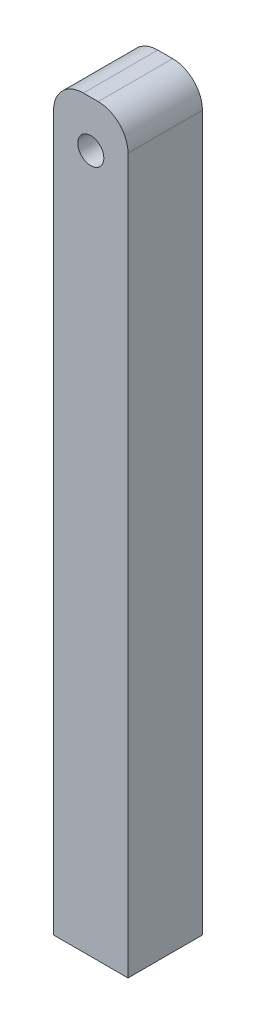
ISO-10303-21;
HEADER;
FILE_DESCRIPTION(('STEP AP214'),'2;1');
FILE_NAME('part.step','',(''),(''),'','','');
FILE_SCHEMA(('AUTOMOTIVE_DESIGN { 1 0 10303 214 1 1 1 1 }'));
ENDSEC;
DATA;
#1=APPLICATION_CONTEXT('core data for automotive mechanical design processes');
#2=APPLICATION_PROTOCOL_DEFINITION('international standard','automotive_design',2000,#1);
#3=PRODUCT_CONTEXT('',#1,'mechanical');
#4=PRODUCT('Part','Part','',(#3));
#5=PRODUCT_RELATED_PRODUCT_CATEGORY('part','',(#4));
#6=PRODUCT_DEFINITION_FORMATION('','',#4);
#7=PRODUCT_DEFINITION_CONTEXT('part definition',#1,'design');
#8=PRODUCT_DEFINITION('design','',#6,#7);
#9=PRODUCT_DEFINITION_SHAPE('','',#8);
#10=(LENGTH_UNIT() NAMED_UNIT(*) SI_UNIT(.MILLI.,.METRE.));
#11=(NAMED_UNIT(*) PLANE_ANGLE_UNIT() SI_UNIT($,.RADIAN.));
#12=(NAMED_UNIT(*) SI_UNIT($,.STERADIAN.) SOLID_ANGLE_UNIT());
#13=UNCERTAINTY_MEASURE_WITH_UNIT(LENGTH_MEASURE(1.E-05),#10,'distance_accuracy_value','');
#14=(GEOMETRIC_REPRESENTATION_CONTEXT(3) GLOBAL_UNCERTAINTY_ASSIGNED_CONTEXT((#13)) GLOBAL_UNIT_ASSIGNED_CONTEXT((#10,
#11,#12)) REPRESENTATION_CONTEXT('',''));
#15=CARTESIAN_POINT('',(0.,0.,0.));
#16=DIRECTION('',(0.,0.,1.));
#17=DIRECTION('',(1.,0.,0.));
#18=AXIS2_PLACEMENT_3D('',#15,#16,#17);
#19=CARTESIAN_POINT('',(5.,-50.,10.));
#20=DIRECTION('',(-1.,0.,0.));
#21=DIRECTION('',(0.,0.,1.));
#22=AXIS2_PLACEMENT_3D('',#19,#20,#21);
#23=PLANE('',#22);
#24=DIRECTION('',(0.,1.,0.));
#25=VECTOR('',#24,1.);
#26=CARTESIAN_POINT('',(5.,-50.,0.));
#27=LINE('',#26,#25);
#28=CARTESIAN_POINT('',(5.,-50.,0.));
#29=VERTEX_POINT('',#28);
#30=CARTESIAN_POINT('',(5.,46.,0.));
#31=VERTEX_POINT('',#30);
#32=EDGE_CURVE('E117',#29,#31,#27,.T.);
#33=ORIENTED_EDGE('',*,*,#32,.T.);
#34=DIRECTION('',(0.,0.,-1.));
#35=VECTOR('',#34,1.);
#36=CARTESIAN_POINT('',(5.,46.,10.));
#37=LINE('',#36,#35);
#38=CARTESIAN_POINT('',(5.,46.,10.));
#39=VERTEX_POINT('',#38);
#40=EDGE_CURVE('E11',#39,#31,#37,.T.);
#41=ORIENTED_EDGE('',*,*,#40,.F.);
#42=DIRECTION('',(0.,1.,0.));
#43=VECTOR('',#42,1.);
#44=CARTESIAN_POINT('',(5.,-50.,10.));
#45=LINE('',#44,#43);
#46=CARTESIAN_POINT('',(5.,-50.,10.));
#47=VERTEX_POINT('',#46);
#48=EDGE_CURVE('E128',#47,#39,#45,.T.);
#49=ORIENTED_EDGE('',*,*,#48,.F.);
#50=DIRECTION('',(0.,0.,-1.));
#51=VECTOR('',#50,1.);
#52=CARTESIAN_POINT('',(5.,-50.,10.));
#53=LINE('',#52,#51);
#54=EDGE_CURVE('E113',#47,#29,#53,.T.);
#55=ORIENTED_EDGE('',*,*,#54,.T.);
#56=EDGE_LOOP('',(#33,#41,#49,#55));
#57=FACE_BOUND('',#56,.T.);
#58=ADVANCED_FACE('F33',(#57),#23,.F.);
#59=CARTESIAN_POINT('',(1.,46.,10.));
#60=DIRECTION('',(0.,0.,-1.));
#61=DIRECTION('',(-1.,0.,0.));
#62=AXIS2_PLACEMENT_3D('',#59,#60,#61);
#63=CYLINDRICAL_SURFACE('',#62,4.);
#64=CARTESIAN_POINT('',(1.,46.,0.));
#65=DIRECTION('',(0.,0.,1.));
#66=DIRECTION('',(1.,0.,0.));
#67=AXIS2_PLACEMENT_3D('',#64,#65,#66);
#68=CIRCLE('',#67,4.);
#69=CARTESIAN_POINT('',(0.999999999999972,50.,0.));
#70=VERTEX_POINT('',#69);
#71=EDGE_CURVE('E120',#31,#70,#68,.T.);
#72=ORIENTED_EDGE('',*,*,#71,.T.);
#73=DIRECTION('',(0.,0.,-1.));
#74=VECTOR('',#73,1.);
#75=CARTESIAN_POINT('',(0.999999999999972,50.,10.));
#76=LINE('',#75,#74);
#77=CARTESIAN_POINT('',(0.999999999999972,50.,10.));
#78=VERTEX_POINT('',#77);
#79=EDGE_CURVE('E41',#78,#70,#76,.T.);
#80=ORIENTED_EDGE('',*,*,#79,.F.);
#81=CARTESIAN_POINT('',(1.,46.,10.));
#82=DIRECTION('',(0.,0.,1.));
#83=DIRECTION('',(1.,0.,0.));
#84=AXIS2_PLACEMENT_3D('',#81,#82,#83);
#85=CIRCLE('',#84,4.);
#86=EDGE_CURVE('E86',#39,#78,#85,.T.);
#87=ORIENTED_EDGE('',*,*,#86,.F.);
#88=ORIENTED_EDGE('',*,*,#40,.T.);
#89=EDGE_LOOP('',(#72,#80,#87,#88));
#90=FACE_BOUND('',#89,.T.);
#91=ADVANCED_FACE('F153',(#90),#63,.T.);
#92=CARTESIAN_POINT('',(0.999999999999972,50.,10.));
#93=DIRECTION('',(0.,-1.,0.));
#94=DIRECTION('',(0.,0.,-1.));
#95=AXIS2_PLACEMENT_3D('',#92,#93,#94);
#96=PLANE('',#95);
#97=DIRECTION('',(-1.,0.,0.));
#98=VECTOR('',#97,1.);
#99=CARTESIAN_POINT('',(0.999999999999972,50.,0.));
#100=LINE('',#99,#98);
#101=CARTESIAN_POINT('',(-0.999999999999972,50.,0.));
#102=VERTEX_POINT('',#101);
#103=EDGE_CURVE('E123',#70,#102,#100,.T.);
#104=ORIENTED_EDGE('',*,*,#103,.T.);
#105=DIRECTION('',(0.,0.,-1.));
#106=VECTOR('',#105,1.);
#107=CARTESIAN_POINT('',(-0.999999999999972,50.,10.));
#108=LINE('',#107,#106);
#109=CARTESIAN_POINT('',(-0.999999999999972,50.,10.));
#110=VERTEX_POINT('',#109);
#111=EDGE_CURVE('E108',#110,#102,#108,.T.);
#112=ORIENTED_EDGE('',*,*,#111,.F.);
#113=DIRECTION('',(-1.,0.,0.));
#114=VECTOR('',#113,1.);
#115=CARTESIAN_POINT('',(0.999999999999972,50.,10.));
#116=LINE('',#115,#114);
#117=EDGE_CURVE('E99',#78,#110,#116,.T.);
#118=ORIENTED_EDGE('',*,*,#117,.F.);
#119=ORIENTED_EDGE('',*,*,#79,.T.);
#120=EDGE_LOOP('',(#104,#112,#118,#119));
#121=FACE_BOUND('',#120,.T.);
#122=ADVANCED_FACE('F134',(#121),#96,.F.);
#123=CARTESIAN_POINT('',(-1.,46.,10.));
#124=DIRECTION('',(0.,0.,-1.));
#125=DIRECTION('',(-1.,0.,0.));
#126=AXIS2_PLACEMENT_3D('',#123,#124,#125);
#127=CYLINDRICAL_SURFACE('',#126,4.);
#128=CARTESIAN_POINT('',(-1.,46.,0.));
#129=DIRECTION('',(0.,0.,1.));
#130=DIRECTION('',(1.,0.,0.));
#131=AXIS2_PLACEMENT_3D('',#128,#129,#130);
#132=CIRCLE('',#131,4.);
#133=CARTESIAN_POINT('',(-5.,46.,0.));
#134=VERTEX_POINT('',#133);
#135=EDGE_CURVE('E107',#102,#134,#132,.T.);
#136=ORIENTED_EDGE('',*,*,#135,.T.);
#137=DIRECTION('',(0.,0.,-1.));
#138=VECTOR('',#137,1.);
#139=CARTESIAN_POINT('',(-5.,46.,10.));
#140=LINE('',#139,#138);
#141=CARTESIAN_POINT('',(-5.,46.,10.));
#142=VERTEX_POINT('',#141);
#143=EDGE_CURVE('E104',#142,#134,#140,.T.);
#144=ORIENTED_EDGE('',*,*,#143,.F.);
#145=CARTESIAN_POINT('',(-1.,46.,10.));
#146=DIRECTION('',(0.,0.,1.));
#147=DIRECTION('',(1.,0.,0.));
#148=AXIS2_PLACEMENT_3D('',#145,#146,#147);
#149=CIRCLE('',#148,4.);
#150=EDGE_CURVE('E93',#110,#142,#149,.T.);
#151=ORIENTED_EDGE('',*,*,#150,.F.);
#152=ORIENTED_EDGE('',*,*,#111,.T.);
#153=EDGE_LOOP('',(#136,#144,#151,#152));
#154=FACE_BOUND('',#153,.T.);
#155=ADVANCED_FACE('F105',(#154),#127,.T.);
#156=CARTESIAN_POINT('',(-5.,-50.,10.));
#157=DIRECTION('',(1.,0.,0.));
#158=DIRECTION('',(0.,0.,-1.));
#159=AXIS2_PLACEMENT_3D('',#156,#157,#158);
#160=PLANE('',#159);
#161=DIRECTION('',(0.,-1.,0.));
#162=VECTOR('',#161,1.);
#163=CARTESIAN_POINT('',(-5.,-50.,0.));
#164=LINE('',#163,#162);
#165=CARTESIAN_POINT('',(-5.,-50.,0.));
#166=VERTEX_POINT('',#165);
#167=EDGE_CURVE('E72',#134,#166,#164,.T.);
#168=ORIENTED_EDGE('',*,*,#167,.T.);
#169=DIRECTION('',(0.,0.,-1.));
#170=VECTOR('',#169,1.);
#171=CARTESIAN_POINT('',(-5.,-50.,10.));
#172=LINE('',#171,#170);
#173=CARTESIAN_POINT('',(-5.,-50.,10.));
#174=VERTEX_POINT('',#173);
#175=EDGE_CURVE('E109',#174,#166,#172,.T.);
#176=ORIENTED_EDGE('',*,*,#175,.F.);
#177=DIRECTION('',(0.,-1.,0.));
#178=VECTOR('',#177,1.);
#179=CARTESIAN_POINT('',(-5.,-50.,10.));
#180=LINE('',#179,#178);
#181=EDGE_CURVE('E97',#142,#174,#180,.T.);
#182=ORIENTED_EDGE('',*,*,#181,.F.);
#183=ORIENTED_EDGE('',*,*,#143,.T.);
#184=EDGE_LOOP('',(#168,#176,#182,#183));
#185=FACE_BOUND('',#184,.T.);
#186=ADVANCED_FACE('F111',(#185),#160,.F.);
#187=CARTESIAN_POINT('',(5.,-50.,10.));
#188=DIRECTION('',(0.,1.,0.));
#189=DIRECTION('',(0.,0.,1.));
#190=AXIS2_PLACEMENT_3D('',#187,#188,#189);
#191=PLANE('',#190);
#192=DIRECTION('',(1.,0.,0.));
#193=VECTOR('',#192,1.);
#194=CARTESIAN_POINT('',(5.,-50.,0.));
#195=LINE('',#194,#193);
#196=EDGE_CURVE('E78',#166,#29,#195,.T.);
#197=ORIENTED_EDGE('',*,*,#196,.T.);
#198=ORIENTED_EDGE('',*,*,#54,.F.);
#199=DIRECTION('',(1.,0.,0.));
#200=VECTOR('',#199,1.);
#201=CARTESIAN_POINT('',(5.,-50.,10.));
#202=LINE('',#201,#200);
#203=EDGE_CURVE('E49',#174,#47,#202,.T.);
#204=ORIENTED_EDGE('',*,*,#203,.F.);
#205=ORIENTED_EDGE('',*,*,#175,.T.);
#206=EDGE_LOOP('',(#197,#198,#204,#205));
#207=FACE_BOUND('',#206,.T.);
#208=ADVANCED_FACE('F141',(#207),#191,.F.);
#209=CARTESIAN_POINT('',(1.,46.,10.));
#210=DIRECTION('',(0.,0.,1.));
#211=DIRECTION('',(1.,0.,0.));
#212=AXIS2_PLACEMENT_3D('',#209,#210,#211);
#213=PLANE('',#212);
#214=CARTESIAN_POINT('',(0.,43.7918169432476,10.));
#215=DIRECTION('',(0.,0.,1.));
#216=DIRECTION('',(1.,0.,0.));
#217=AXIS2_PLACEMENT_3D('',#214,#215,#216);
#218=CIRCLE('',#217,1.75);
#219=CARTESIAN_POINT('',(1.75,43.7918169432476,10.));
#220=VERTEX_POINT('',#219);
#221=EDGE_CURVE('E214',#220,#220,#218,.T.);
#222=ORIENTED_EDGE('',*,*,#221,.F.);
#223=EDGE_LOOP('',(#222));
#224=FACE_BOUND('',#223,.T.);
#225=ORIENTED_EDGE('',*,*,#48,.T.);
#226=ORIENTED_EDGE('',*,*,#86,.T.);
#227=ORIENTED_EDGE('',*,*,#117,.T.);
#228=ORIENTED_EDGE('',*,*,#150,.T.);
#229=ORIENTED_EDGE('',*,*,#181,.T.);
#230=ORIENTED_EDGE('',*,*,#203,.T.);
#231=EDGE_LOOP('',(#225,#226,#227,#228,#229,#230));
#232=FACE_BOUND('',#231,.T.);
#233=ADVANCED_FACE('F95',(#224,#232),#213,.T.);
#234=CARTESIAN_POINT('',(1.,46.,0.));
#235=DIRECTION('',(0.,0.,1.));
#236=DIRECTION('',(1.,0.,0.));
#237=AXIS2_PLACEMENT_3D('',#234,#235,#236);
#238=PLANE('',#237);
#239=ORIENTED_EDGE('',*,*,#32,.F.);
#240=ORIENTED_EDGE('',*,*,#196,.F.);
#241=ORIENTED_EDGE('',*,*,#167,.F.);
#242=ORIENTED_EDGE('',*,*,#135,.F.);
#243=ORIENTED_EDGE('',*,*,#103,.F.);
#244=ORIENTED_EDGE('',*,*,#71,.F.);
#245=EDGE_LOOP('',(#239,#240,#241,#242,#243,#244));
#246=FACE_BOUND('',#245,.T.);
#247=ADVANCED_FACE('F137',(#246),#238,.F.);
#248=CARTESIAN_POINT('',(0.,43.7918169432476,7.));
#249=DIRECTION('',(0.,0.,1.));
#250=DIRECTION('',(1.,0.,0.));
#251=AXIS2_PLACEMENT_3D('',#248,#249,#250);
#252=CYLINDRICAL_SURFACE('',#251,1.75);
#253=CARTESIAN_POINT('',(0.,43.7918169432476,7.));
#254=DIRECTION('',(0.,0.,1.));
#255=DIRECTION('',(1.,0.,0.));
#256=AXIS2_PLACEMENT_3D('',#253,#254,#255);
#257=CIRCLE('',#256,1.75);
#258=CARTESIAN_POINT('',(1.75,43.7918169432476,7.));
#259=VERTEX_POINT('',#258);
#260=EDGE_CURVE('E121',#259,#259,#257,.T.);
#261=ORIENTED_EDGE('',*,*,#260,.F.);
#262=EDGE_LOOP('',(#261));
#263=FACE_BOUND('',#262,.T.);
#264=ORIENTED_EDGE('',*,*,#221,.T.);
#265=EDGE_LOOP('',(#264));
#266=FACE_BOUND('',#265,.T.);
#267=ADVANCED_FACE('F185',(#263,#266),#252,.F.);
#268=CARTESIAN_POINT('',(0.,43.7918169432476,7.));
#269=DIRECTION('',(0.,0.,1.));
#270=DIRECTION('',(1.,0.,0.));
#271=AXIS2_PLACEMENT_3D('',#268,#269,#270);
#272=PLANE('',#271);
#273=ORIENTED_EDGE('',*,*,#260,.T.);
#274=EDGE_LOOP('',(#273));
#275=FACE_BOUND('',#274,.T.);
#276=ADVANCED_FACE('F198',(#275),#272,.T.);
#277=CLOSED_SHELL('',(#58,#91,#122,#155,#186,#208,#233,#247,#267,#276));
#278=MANIFOLD_SOLID_BREP('B2',#277);
#279=ADVANCED_BREP_SHAPE_REPRESENTATION('',(#18,#278),#14);
#280=SHAPE_DEFINITION_REPRESENTATION(#9,#279);
ENDSEC;
END-ISO-10303-21;
